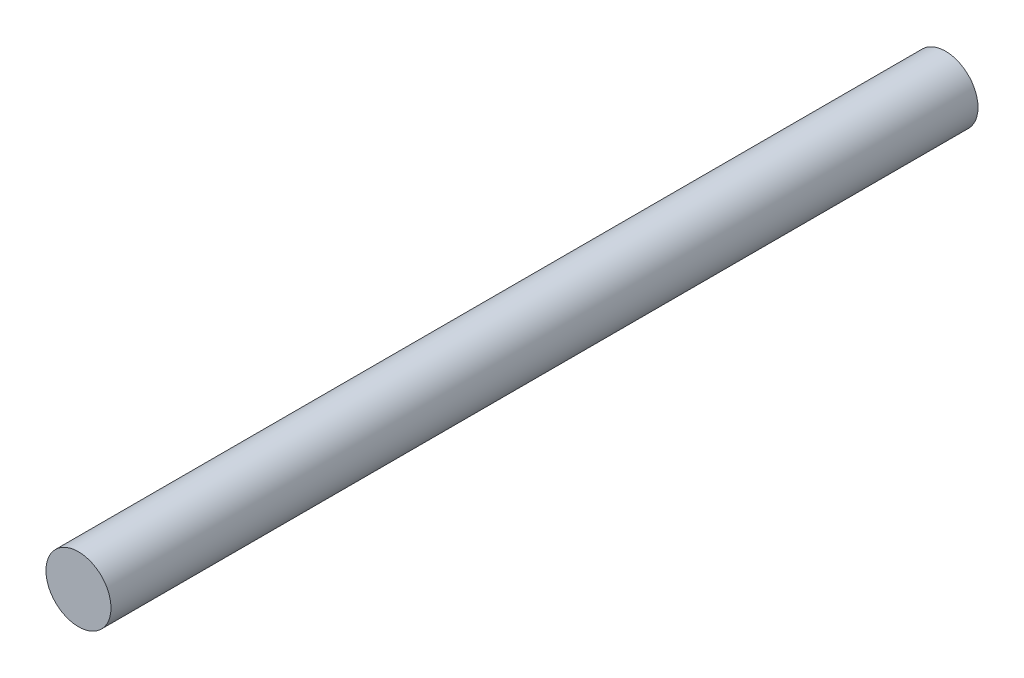
ISO-10303-21;
HEADER;
FILE_DESCRIPTION(('STEP AP214'),'2;1');
FILE_NAME('part.step','',(''),(''),'','','');
FILE_SCHEMA(('AUTOMOTIVE_DESIGN { 1 0 10303 214 1 1 1 1 }'));
ENDSEC;
DATA;
#1=APPLICATION_CONTEXT('core data for automotive mechanical design processes');
#2=APPLICATION_PROTOCOL_DEFINITION('international standard','automotive_design',2000,#1);
#3=PRODUCT_CONTEXT('',#1,'mechanical');
#4=PRODUCT('Part','Part','',(#3));
#5=PRODUCT_RELATED_PRODUCT_CATEGORY('part','',(#4));
#6=PRODUCT_DEFINITION_FORMATION('','',#4);
#7=PRODUCT_DEFINITION_CONTEXT('part definition',#1,'design');
#8=PRODUCT_DEFINITION('design','',#6,#7);
#9=PRODUCT_DEFINITION_SHAPE('','',#8);
#10=(LENGTH_UNIT() NAMED_UNIT(*) SI_UNIT(.MILLI.,.METRE.));
#11=(NAMED_UNIT(*) PLANE_ANGLE_UNIT() SI_UNIT($,.RADIAN.));
#12=(NAMED_UNIT(*) SI_UNIT($,.STERADIAN.) SOLID_ANGLE_UNIT());
#13=UNCERTAINTY_MEASURE_WITH_UNIT(LENGTH_MEASURE(1.E-05),#10,'distance_accuracy_value','');
#14=(GEOMETRIC_REPRESENTATION_CONTEXT(3) GLOBAL_UNCERTAINTY_ASSIGNED_CONTEXT((#13)) GLOBAL_UNIT_ASSIGNED_CONTEXT((#10,
#11,#12)) REPRESENTATION_CONTEXT('',''));
#15=CARTESIAN_POINT('',(0.,0.,0.));
#16=DIRECTION('',(0.,0.,1.));
#17=DIRECTION('',(1.,0.,0.));
#18=AXIS2_PLACEMENT_3D('',#15,#16,#17);
#19=CARTESIAN_POINT('',(0.,0.,40.));
#20=DIRECTION('',(0.,0.,-1.));
#21=DIRECTION('',(-1.,0.,0.));
#22=AXIS2_PLACEMENT_3D('',#19,#20,#21);
#23=CYLINDRICAL_SURFACE('',#22,1.5);
#24=CARTESIAN_POINT('',(0.,0.,40.));
#25=DIRECTION('',(0.,0.,1.));
#26=DIRECTION('',(1.,0.,0.));
#27=AXIS2_PLACEMENT_3D('',#24,#25,#26);
#28=CIRCLE('',#27,1.5);
#29=CARTESIAN_POINT('',(1.5,0.,40.));
#30=VERTEX_POINT('',#29);
#31=EDGE_CURVE('E12',#30,#30,#28,.T.);
#32=ORIENTED_EDGE('',*,*,#31,.F.);
#33=EDGE_LOOP('',(#32));
#34=FACE_BOUND('',#33,.T.);
#35=CARTESIAN_POINT('',(0.,0.,0.));
#36=DIRECTION('',(0.,0.,1.));
#37=DIRECTION('',(1.,0.,0.));
#38=AXIS2_PLACEMENT_3D('',#35,#36,#37);
#39=CIRCLE('',#38,1.5);
#40=CARTESIAN_POINT('',(1.5,0.,0.));
#41=VERTEX_POINT('',#40);
#42=EDGE_CURVE('E46',#41,#41,#39,.T.);
#43=ORIENTED_EDGE('',*,*,#42,.T.);
#44=EDGE_LOOP('',(#43));
#45=FACE_BOUND('',#44,.T.);
#46=ADVANCED_FACE('F43',(#34,#45),#23,.T.);
#47=CARTESIAN_POINT('',(0.,0.,40.));
#48=DIRECTION('',(0.,0.,1.));
#49=DIRECTION('',(1.,0.,0.));
#50=AXIS2_PLACEMENT_3D('',#47,#48,#49);
#51=PLANE('',#50);
#52=ORIENTED_EDGE('',*,*,#31,.T.);
#53=EDGE_LOOP('',(#52));
#54=FACE_BOUND('',#53,.T.);
#55=ADVANCED_FACE('F58',(#54),#51,.T.);
#56=CARTESIAN_POINT('',(0.,0.,0.));
#57=DIRECTION('',(0.,0.,1.));
#58=DIRECTION('',(1.,0.,0.));
#59=AXIS2_PLACEMENT_3D('',#56,#57,#58);
#60=PLANE('',#59);
#61=ORIENTED_EDGE('',*,*,#42,.F.);
#62=EDGE_LOOP('',(#61));
#63=FACE_BOUND('',#62,.T.);
#64=ADVANCED_FACE('F56',(#63),#60,.F.);
#65=CLOSED_SHELL('',(#46,#55,#64));
#66=MANIFOLD_SOLID_BREP('B2',#65);
#67=ADVANCED_BREP_SHAPE_REPRESENTATION('',(#18,#66),#14);
#68=SHAPE_DEFINITION_REPRESENTATION(#9,#67);
ENDSEC;
END-ISO-10303-21;
